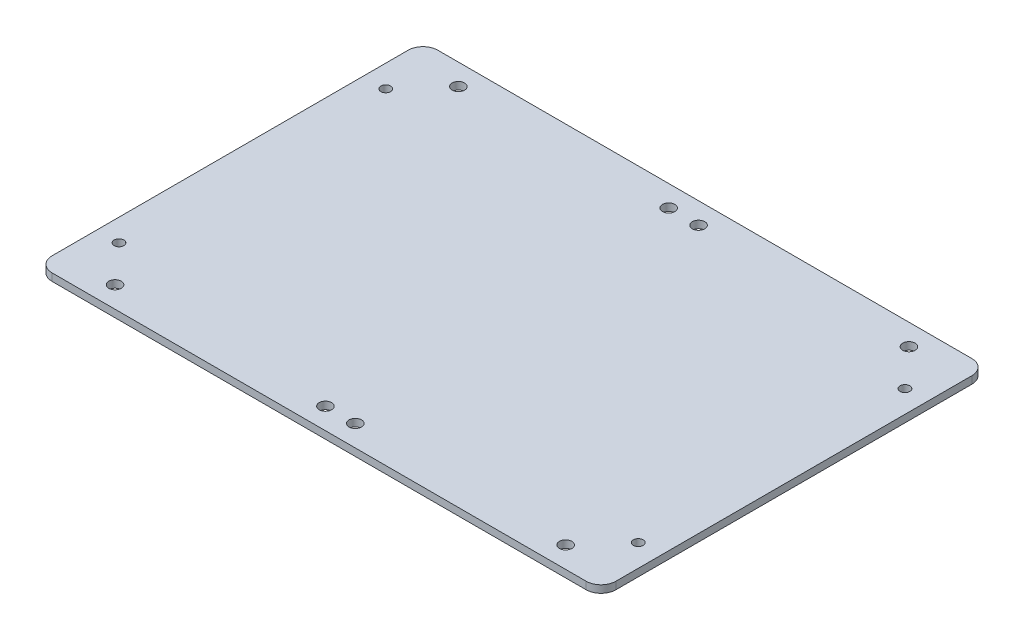
ISO-10303-21;
HEADER;
FILE_DESCRIPTION(('STEP AP214'),'2;1');
FILE_NAME('part.step','',(''),(''),'','','');
FILE_SCHEMA(('AUTOMOTIVE_DESIGN { 1 0 10303 214 1 1 1 1 }'));
ENDSEC;
DATA;
#1=APPLICATION_CONTEXT('core data for automotive mechanical design processes');
#2=APPLICATION_PROTOCOL_DEFINITION('international standard','automotive_design',2000,#1);
#3=PRODUCT_CONTEXT('',#1,'mechanical');
#4=PRODUCT('Part','Part','',(#3));
#5=PRODUCT_RELATED_PRODUCT_CATEGORY('part','',(#4));
#6=PRODUCT_DEFINITION_FORMATION('','',#4);
#7=PRODUCT_DEFINITION_CONTEXT('part definition',#1,'design');
#8=PRODUCT_DEFINITION('design','',#6,#7);
#9=PRODUCT_DEFINITION_SHAPE('','',#8);
#10=(LENGTH_UNIT() NAMED_UNIT(*) SI_UNIT(.MILLI.,.METRE.));
#11=(NAMED_UNIT(*) PLANE_ANGLE_UNIT() SI_UNIT($,.RADIAN.));
#12=(NAMED_UNIT(*) SI_UNIT($,.STERADIAN.) SOLID_ANGLE_UNIT());
#13=UNCERTAINTY_MEASURE_WITH_UNIT(LENGTH_MEASURE(1.E-05),#10,'distance_accuracy_value','');
#14=(GEOMETRIC_REPRESENTATION_CONTEXT(3) GLOBAL_UNCERTAINTY_ASSIGNED_CONTEXT((#13)) GLOBAL_UNIT_ASSIGNED_CONTEXT((#10,
#11,#12)) REPRESENTATION_CONTEXT('',''));
#15=CARTESIAN_POINT('',(0.,0.,0.));
#16=DIRECTION('',(0.,0.,1.));
#17=DIRECTION('',(1.,0.,0.));
#18=AXIS2_PLACEMENT_3D('',#15,#16,#17);
#19=CARTESIAN_POINT('',(0.,6.35,0.));
#20=DIRECTION('',(0.,-1.,0.));
#21=DIRECTION('',(0.,0.,-1.));
#22=AXIS2_PLACEMENT_3D('',#19,#20,#21);
#23=PLANE('',#22);
#24=DIRECTION('',(1.,0.,0.));
#25=VECTOR('',#24,1.);
#26=CARTESIAN_POINT('',(-38.1,6.35,0.));
#27=LINE('',#26,#25);
#28=CARTESIAN_POINT('',(-25.4,6.35,0.));
#29=VERTEX_POINT('',#28);
#30=CARTESIAN_POINT('',(431.8,6.35,0.));
#31=VERTEX_POINT('',#30);
#32=EDGE_CURVE('E150',#29,#31,#27,.T.);
#33=ORIENTED_EDGE('',*,*,#32,.T.);
#34=CARTESIAN_POINT('',(431.8,6.35,-12.7));
#35=DIRECTION('',(0.,-1.,0.));
#36=DIRECTION('',(0.,0.,-1.));
#37=AXIS2_PLACEMENT_3D('',#34,#35,#36);
#38=CIRCLE('',#37,12.7);
#39=CARTESIAN_POINT('',(444.5,6.35,-12.7));
#40=VERTEX_POINT('',#39);
#41=EDGE_CURVE('E174',#31,#40,#38,.F.);
#42=ORIENTED_EDGE('',*,*,#41,.T.);
#43=DIRECTION('',(0.,0.,-1.));
#44=VECTOR('',#43,1.);
#45=CARTESIAN_POINT('',(444.5,6.35,-330.2));
#46=LINE('',#45,#44);
#47=CARTESIAN_POINT('',(444.5,6.35,-317.5));
#48=VERTEX_POINT('',#47);
#49=EDGE_CURVE('E127',#40,#48,#46,.T.);
#50=ORIENTED_EDGE('',*,*,#49,.T.);
#51=CARTESIAN_POINT('',(431.8,6.35,-317.5));
#52=DIRECTION('',(0.,-1.,0.));
#53=DIRECTION('',(0.,0.,-1.));
#54=AXIS2_PLACEMENT_3D('',#51,#52,#53);
#55=CIRCLE('',#54,12.7);
#56=CARTESIAN_POINT('',(431.8,6.35,-330.2));
#57=VERTEX_POINT('',#56);
#58=EDGE_CURVE('E166',#48,#57,#55,.F.);
#59=ORIENTED_EDGE('',*,*,#58,.T.);
#60=DIRECTION('',(-1.,0.,0.));
#61=VECTOR('',#60,1.);
#62=CARTESIAN_POINT('',(406.4,6.35,-330.2));
#63=LINE('',#62,#61);
#64=CARTESIAN_POINT('',(-25.4,6.35,-330.2));
#65=VERTEX_POINT('',#64);
#66=EDGE_CURVE('E189',#57,#65,#63,.T.);
#67=ORIENTED_EDGE('',*,*,#66,.T.);
#68=CARTESIAN_POINT('',(-25.4,6.35,-317.5));
#69=DIRECTION('',(0.,-1.,0.));
#70=DIRECTION('',(0.,0.,-1.));
#71=AXIS2_PLACEMENT_3D('',#68,#69,#70);
#72=CIRCLE('',#71,12.7);
#73=CARTESIAN_POINT('',(-38.1,6.35,-317.5));
#74=VERTEX_POINT('',#73);
#75=EDGE_CURVE('E62',#65,#74,#72,.F.);
#76=ORIENTED_EDGE('',*,*,#75,.T.);
#77=DIRECTION('',(0.,0.,1.));
#78=VECTOR('',#77,1.);
#79=CARTESIAN_POINT('',(-38.1,6.35,-330.2));
#80=LINE('',#79,#78);
#81=CARTESIAN_POINT('',(-38.1,6.35,-12.7));
#82=VERTEX_POINT('',#81);
#83=EDGE_CURVE('E152',#74,#82,#80,.T.);
#84=ORIENTED_EDGE('',*,*,#83,.T.);
#85=CARTESIAN_POINT('',(-25.4,6.35,-12.7));
#86=DIRECTION('',(0.,-1.,0.));
#87=DIRECTION('',(0.,0.,-1.));
#88=AXIS2_PLACEMENT_3D('',#85,#86,#87);
#89=CIRCLE('',#88,12.7);
#90=EDGE_CURVE('E171',#82,#29,#89,.F.);
#91=ORIENTED_EDGE('',*,*,#90,.T.);
#92=EDGE_LOOP('',(#33,#42,#50,#59,#67,#76,#84,#91));
#93=FACE_BOUND('',#92,.T.);
#94=CARTESIAN_POINT('',(10.3248582778819,6.35,-312.039));
#95=DIRECTION('',(0.,1.,0.));
#96=DIRECTION('',(0.,0.,1.));
#97=AXIS2_PLACEMENT_3D('',#94,#95,#96);
#98=CIRCLE('',#97,5.33400000000001);
#99=CARTESIAN_POINT('',(10.3248582778819,6.35,-306.705));
#100=VERTEX_POINT('',#99);
#101=EDGE_CURVE('E144',#100,#100,#98,.T.);
#102=ORIENTED_EDGE('',*,*,#101,.F.);
#103=EDGE_LOOP('',(#102));
#104=FACE_BOUND('',#103,.T.);
#105=CARTESIAN_POINT('',(10.3248582778819,6.35,-18.161));
#106=DIRECTION('',(0.,1.,0.));
#107=DIRECTION('',(0.,0.,1.));
#108=AXIS2_PLACEMENT_3D('',#105,#106,#107);
#109=CIRCLE('',#108,5.334);
#110=CARTESIAN_POINT('',(10.3248582778819,6.35,-12.827));
#111=VERTEX_POINT('',#110);
#112=EDGE_CURVE('E211',#111,#111,#109,.T.);
#113=ORIENTED_EDGE('',*,*,#112,.F.);
#114=EDGE_LOOP('',(#113));
#115=FACE_BOUND('',#114,.T.);
#116=CARTESIAN_POINT('',(190.410858277882,6.35,-312.039));
#117=DIRECTION('',(0.,1.,0.));
#118=DIRECTION('',(0.,0.,1.));
#119=AXIS2_PLACEMENT_3D('',#116,#117,#118);
#120=CIRCLE('',#119,5.334);
#121=CARTESIAN_POINT('',(190.410858277882,6.35,-306.705));
#122=VERTEX_POINT('',#121);
#123=EDGE_CURVE('E219',#122,#122,#120,.T.);
#124=ORIENTED_EDGE('',*,*,#123,.F.);
#125=EDGE_LOOP('',(#124));
#126=FACE_BOUND('',#125,.T.);
#127=CARTESIAN_POINT('',(190.410858277882,6.35,-18.161));
#128=DIRECTION('',(0.,1.,0.));
#129=DIRECTION('',(0.,0.,-1.));
#130=AXIS2_PLACEMENT_3D('',#127,#128,#129);
#131=CIRCLE('',#130,5.334);
#132=CARTESIAN_POINT('',(190.410858277882,6.35,-23.495));
#133=VERTEX_POINT('',#132);
#134=EDGE_CURVE('E227',#133,#133,#131,.T.);
#135=ORIENTED_EDGE('',*,*,#134,.F.);
#136=EDGE_LOOP('',(#135));
#137=FACE_BOUND('',#136,.T.);
#138=CARTESIAN_POINT('',(215.989141722118,6.35,-18.161));
#139=DIRECTION('',(0.,1.,0.));
#140=DIRECTION('',(0.,0.,1.));
#141=AXIS2_PLACEMENT_3D('',#138,#139,#140);
#142=CIRCLE('',#141,5.334);
#143=CARTESIAN_POINT('',(215.989141722118,6.35,-12.827));
#144=VERTEX_POINT('',#143);
#145=EDGE_CURVE('E235',#144,#144,#142,.T.);
#146=ORIENTED_EDGE('',*,*,#145,.F.);
#147=EDGE_LOOP('',(#146));
#148=FACE_BOUND('',#147,.T.);
#149=CARTESIAN_POINT('',(396.075141722118,6.35,-18.161));
#150=DIRECTION('',(0.,1.,0.));
#151=DIRECTION('',(0.,0.,-1.));
#152=AXIS2_PLACEMENT_3D('',#149,#150,#151);
#153=CIRCLE('',#152,5.33399999999999);
#154=CARTESIAN_POINT('',(396.075141722118,6.35,-23.495));
#155=VERTEX_POINT('',#154);
#156=EDGE_CURVE('E243',#155,#155,#153,.T.);
#157=ORIENTED_EDGE('',*,*,#156,.F.);
#158=EDGE_LOOP('',(#157));
#159=FACE_BOUND('',#158,.T.);
#160=CARTESIAN_POINT('',(215.989141722118,6.35,-312.039));
#161=DIRECTION('',(0.,1.,0.));
#162=DIRECTION('',(0.,0.,-1.));
#163=AXIS2_PLACEMENT_3D('',#160,#161,#162);
#164=CIRCLE('',#163,5.334);
#165=CARTESIAN_POINT('',(215.989141722118,6.35,-317.373));
#166=VERTEX_POINT('',#165);
#167=EDGE_CURVE('E251',#166,#166,#164,.T.);
#168=ORIENTED_EDGE('',*,*,#167,.F.);
#169=EDGE_LOOP('',(#168));
#170=FACE_BOUND('',#169,.T.);
#171=CARTESIAN_POINT('',(396.075141722118,6.35,-312.039));
#172=DIRECTION('',(0.,1.,0.));
#173=DIRECTION('',(0.,0.,-1.));
#174=AXIS2_PLACEMENT_3D('',#171,#172,#173);
#175=CIRCLE('',#174,5.334);
#176=CARTESIAN_POINT('',(396.075141722118,6.35,-317.373));
#177=VERTEX_POINT('',#176);
#178=EDGE_CURVE('E259',#177,#177,#175,.T.);
#179=ORIENTED_EDGE('',*,*,#178,.F.);
#180=EDGE_LOOP('',(#179));
#181=FACE_BOUND('',#180,.T.);
#182=CARTESIAN_POINT('',(-19.05,6.35,-279.273));
#183=DIRECTION('',(0.,1.,0.));
#184=DIRECTION('',(0.,0.,1.));
#185=AXIS2_PLACEMENT_3D('',#182,#183,#184);
#186=CIRCLE('',#185,4.191);
#187=CARTESIAN_POINT('',(-19.05,6.35,-275.082));
#188=VERTEX_POINT('',#187);
#189=EDGE_CURVE('E267',#188,#188,#186,.T.);
#190=ORIENTED_EDGE('',*,*,#189,.F.);
#191=EDGE_LOOP('',(#190));
#192=FACE_BOUND('',#191,.T.);
#193=CARTESIAN_POINT('',(-19.05,6.35,-50.927));
#194=DIRECTION('',(0.,1.,0.));
#195=DIRECTION('',(0.,0.,-1.));
#196=AXIS2_PLACEMENT_3D('',#193,#194,#195);
#197=CIRCLE('',#196,4.191);
#198=CARTESIAN_POINT('',(-19.05,6.35,-55.118));
#199=VERTEX_POINT('',#198);
#200=EDGE_CURVE('E275',#199,#199,#197,.T.);
#201=ORIENTED_EDGE('',*,*,#200,.F.);
#202=EDGE_LOOP('',(#201));
#203=FACE_BOUND('',#202,.T.);
#204=CARTESIAN_POINT('',(425.45,6.35,-50.927));
#205=DIRECTION('',(0.,1.,0.));
#206=DIRECTION('',(0.,0.,1.));
#207=AXIS2_PLACEMENT_3D('',#204,#205,#206);
#208=CIRCLE('',#207,4.19100000000002);
#209=CARTESIAN_POINT('',(425.45,6.35,-46.736));
#210=VERTEX_POINT('',#209);
#211=EDGE_CURVE('E283',#210,#210,#208,.T.);
#212=ORIENTED_EDGE('',*,*,#211,.F.);
#213=EDGE_LOOP('',(#212));
#214=FACE_BOUND('',#213,.T.);
#215=CARTESIAN_POINT('',(425.45,6.35,-279.273));
#216=DIRECTION('',(0.,1.,0.));
#217=DIRECTION('',(0.,0.,-1.));
#218=AXIS2_PLACEMENT_3D('',#215,#216,#217);
#219=CIRCLE('',#218,4.19100000000002);
#220=CARTESIAN_POINT('',(425.45,6.35,-283.464));
#221=VERTEX_POINT('',#220);
#222=EDGE_CURVE('E291',#221,#221,#219,.T.);
#223=ORIENTED_EDGE('',*,*,#222,.F.);
#224=EDGE_LOOP('',(#223));
#225=FACE_BOUND('',#224,.T.);
#226=ADVANCED_FACE('F39',(#93,#104,#115,#126,#137,#148,#159,#170,#181,#192,#203,#214,#225),#23,.F.);
#227=CARTESIAN_POINT('',(0.,0.,0.));
#228=DIRECTION('',(0.,-1.,0.));
#229=DIRECTION('',(0.,0.,-1.));
#230=AXIS2_PLACEMENT_3D('',#227,#228,#229);
#231=PLANE('',#230);
#232=CARTESIAN_POINT('',(425.45,0.,-50.927));
#233=DIRECTION('',(0.,1.,0.));
#234=DIRECTION('',(0.,0.,1.));
#235=AXIS2_PLACEMENT_3D('',#232,#233,#234);
#236=CIRCLE('',#235,4.19100000000002);
#237=CARTESIAN_POINT('',(425.45,0.,-46.736));
#238=VERTEX_POINT('',#237);
#239=EDGE_CURVE('E287',#238,#238,#236,.T.);
#240=ORIENTED_EDGE('',*,*,#239,.T.);
#241=EDGE_LOOP('',(#240));
#242=FACE_BOUND('',#241,.T.);
#243=CARTESIAN_POINT('',(-19.05,0.,-279.273));
#244=DIRECTION('',(0.,1.,0.));
#245=DIRECTION('',(0.,0.,1.));
#246=AXIS2_PLACEMENT_3D('',#243,#244,#245);
#247=CIRCLE('',#246,4.191);
#248=CARTESIAN_POINT('',(-19.05,0.,-275.082));
#249=VERTEX_POINT('',#248);
#250=EDGE_CURVE('E271',#249,#249,#247,.T.);
#251=ORIENTED_EDGE('',*,*,#250,.T.);
#252=EDGE_LOOP('',(#251));
#253=FACE_BOUND('',#252,.T.);
#254=CARTESIAN_POINT('',(215.989141722118,0.,-312.039));
#255=DIRECTION('',(0.,1.,0.));
#256=DIRECTION('',(0.,0.,-1.));
#257=AXIS2_PLACEMENT_3D('',#254,#255,#256);
#258=CIRCLE('',#257,5.334);
#259=CARTESIAN_POINT('',(215.989141722118,0.,-317.373));
#260=VERTEX_POINT('',#259);
#261=EDGE_CURVE('E255',#260,#260,#258,.T.);
#262=ORIENTED_EDGE('',*,*,#261,.T.);
#263=EDGE_LOOP('',(#262));
#264=FACE_BOUND('',#263,.T.);
#265=CARTESIAN_POINT('',(215.989141722118,0.,-18.161));
#266=DIRECTION('',(0.,1.,0.));
#267=DIRECTION('',(0.,0.,1.));
#268=AXIS2_PLACEMENT_3D('',#265,#266,#267);
#269=CIRCLE('',#268,5.334);
#270=CARTESIAN_POINT('',(215.989141722118,0.,-12.827));
#271=VERTEX_POINT('',#270);
#272=EDGE_CURVE('E239',#271,#271,#269,.T.);
#273=ORIENTED_EDGE('',*,*,#272,.T.);
#274=EDGE_LOOP('',(#273));
#275=FACE_BOUND('',#274,.T.);
#276=CARTESIAN_POINT('',(190.410858277882,0.,-312.039));
#277=DIRECTION('',(0.,1.,0.));
#278=DIRECTION('',(0.,0.,1.));
#279=AXIS2_PLACEMENT_3D('',#276,#277,#278);
#280=CIRCLE('',#279,5.334);
#281=CARTESIAN_POINT('',(190.410858277882,0.,-306.705));
#282=VERTEX_POINT('',#281);
#283=EDGE_CURVE('E223',#282,#282,#280,.T.);
#284=ORIENTED_EDGE('',*,*,#283,.T.);
#285=EDGE_LOOP('',(#284));
#286=FACE_BOUND('',#285,.T.);
#287=CARTESIAN_POINT('',(10.3248582778819,0.,-312.039));
#288=DIRECTION('',(0.,1.,0.));
#289=DIRECTION('',(0.,0.,1.));
#290=AXIS2_PLACEMENT_3D('',#287,#288,#289);
#291=CIRCLE('',#290,5.33400000000001);
#292=CARTESIAN_POINT('',(10.3248582778819,0.,-306.705));
#293=VERTEX_POINT('',#292);
#294=EDGE_CURVE('E207',#293,#293,#291,.T.);
#295=ORIENTED_EDGE('',*,*,#294,.T.);
#296=EDGE_LOOP('',(#295));
#297=FACE_BOUND('',#296,.T.);
#298=DIRECTION('',(0.,0.,-1.));
#299=VECTOR('',#298,1.);
#300=CARTESIAN_POINT('',(444.5,0.,-330.2));
#301=LINE('',#300,#299);
#302=CARTESIAN_POINT('',(444.5,0.,-12.7));
#303=VERTEX_POINT('',#302);
#304=CARTESIAN_POINT('',(444.5,0.,-317.5));
#305=VERTEX_POINT('',#304);
#306=EDGE_CURVE('E124',#303,#305,#301,.T.);
#307=ORIENTED_EDGE('',*,*,#306,.F.);
#308=CARTESIAN_POINT('',(431.8,0.,-12.7));
#309=DIRECTION('',(0.,-1.,0.));
#310=DIRECTION('',(0.,0.,-1.));
#311=AXIS2_PLACEMENT_3D('',#308,#309,#310);
#312=CIRCLE('',#311,12.7);
#313=CARTESIAN_POINT('',(431.8,0.,0.));
#314=VERTEX_POINT('',#313);
#315=EDGE_CURVE('E106',#303,#314,#312,.T.);
#316=ORIENTED_EDGE('',*,*,#315,.T.);
#317=DIRECTION('',(1.,0.,0.));
#318=VECTOR('',#317,1.);
#319=CARTESIAN_POINT('',(444.5,0.,0.));
#320=LINE('',#319,#318);
#321=CARTESIAN_POINT('',(-25.4,0.,0.));
#322=VERTEX_POINT('',#321);
#323=EDGE_CURVE('E137',#322,#314,#320,.T.);
#324=ORIENTED_EDGE('',*,*,#323,.F.);
#325=CARTESIAN_POINT('',(-25.4,0.,-12.7));
#326=DIRECTION('',(0.,-1.,0.));
#327=DIRECTION('',(0.,0.,-1.));
#328=AXIS2_PLACEMENT_3D('',#325,#326,#327);
#329=CIRCLE('',#328,12.7);
#330=CARTESIAN_POINT('',(-38.1,0.,-12.7));
#331=VERTEX_POINT('',#330);
#332=EDGE_CURVE('E118',#322,#331,#329,.T.);
#333=ORIENTED_EDGE('',*,*,#332,.T.);
#334=DIRECTION('',(0.,0.,1.));
#335=VECTOR('',#334,1.);
#336=CARTESIAN_POINT('',(-38.1,0.,-330.2));
#337=LINE('',#336,#335);
#338=CARTESIAN_POINT('',(-38.1,0.,-317.5));
#339=VERTEX_POINT('',#338);
#340=EDGE_CURVE('E142',#339,#331,#337,.T.);
#341=ORIENTED_EDGE('',*,*,#340,.F.);
#342=CARTESIAN_POINT('',(-25.4,0.,-317.5));
#343=DIRECTION('',(0.,-1.,0.));
#344=DIRECTION('',(0.,0.,-1.));
#345=AXIS2_PLACEMENT_3D('',#342,#343,#344);
#346=CIRCLE('',#345,12.7);
#347=CARTESIAN_POINT('',(-25.4,0.,-330.2));
#348=VERTEX_POINT('',#347);
#349=EDGE_CURVE('E156',#339,#348,#346,.T.);
#350=ORIENTED_EDGE('',*,*,#349,.T.);
#351=DIRECTION('',(-1.,0.,0.));
#352=VECTOR('',#351,1.);
#353=CARTESIAN_POINT('',(0.,0.,-330.2));
#354=LINE('',#353,#352);
#355=CARTESIAN_POINT('',(431.8,0.,-330.2));
#356=VERTEX_POINT('',#355);
#357=EDGE_CURVE('E136',#356,#348,#354,.T.);
#358=ORIENTED_EDGE('',*,*,#357,.F.);
#359=CARTESIAN_POINT('',(431.8,0.,-317.5));
#360=DIRECTION('',(0.,-1.,0.));
#361=DIRECTION('',(0.,0.,-1.));
#362=AXIS2_PLACEMENT_3D('',#359,#360,#361);
#363=CIRCLE('',#362,12.7);
#364=EDGE_CURVE('E129',#356,#305,#363,.T.);
#365=ORIENTED_EDGE('',*,*,#364,.T.);
#366=EDGE_LOOP('',(#307,#316,#324,#333,#341,#350,#358,#365));
#367=FACE_BOUND('',#366,.T.);
#368=CARTESIAN_POINT('',(10.3248582778819,0.,-18.161));
#369=DIRECTION('',(0.,1.,0.));
#370=DIRECTION('',(0.,0.,1.));
#371=AXIS2_PLACEMENT_3D('',#368,#369,#370);
#372=CIRCLE('',#371,5.334);
#373=CARTESIAN_POINT('',(10.3248582778819,0.,-12.827));
#374=VERTEX_POINT('',#373);
#375=EDGE_CURVE('E215',#374,#374,#372,.T.);
#376=ORIENTED_EDGE('',*,*,#375,.T.);
#377=EDGE_LOOP('',(#376));
#378=FACE_BOUND('',#377,.T.);
#379=CARTESIAN_POINT('',(190.410858277882,0.,-18.161));
#380=DIRECTION('',(0.,1.,0.));
#381=DIRECTION('',(0.,0.,-1.));
#382=AXIS2_PLACEMENT_3D('',#379,#380,#381);
#383=CIRCLE('',#382,5.334);
#384=CARTESIAN_POINT('',(190.410858277882,0.,-23.495));
#385=VERTEX_POINT('',#384);
#386=EDGE_CURVE('E231',#385,#385,#383,.T.);
#387=ORIENTED_EDGE('',*,*,#386,.T.);
#388=EDGE_LOOP('',(#387));
#389=FACE_BOUND('',#388,.T.);
#390=CARTESIAN_POINT('',(396.075141722118,0.,-18.161));
#391=DIRECTION('',(0.,1.,0.));
#392=DIRECTION('',(0.,0.,-1.));
#393=AXIS2_PLACEMENT_3D('',#390,#391,#392);
#394=CIRCLE('',#393,5.33399999999999);
#395=CARTESIAN_POINT('',(396.075141722118,0.,-23.495));
#396=VERTEX_POINT('',#395);
#397=EDGE_CURVE('E247',#396,#396,#394,.T.);
#398=ORIENTED_EDGE('',*,*,#397,.T.);
#399=EDGE_LOOP('',(#398));
#400=FACE_BOUND('',#399,.T.);
#401=CARTESIAN_POINT('',(396.075141722118,0.,-312.039));
#402=DIRECTION('',(0.,1.,0.));
#403=DIRECTION('',(0.,0.,-1.));
#404=AXIS2_PLACEMENT_3D('',#401,#402,#403);
#405=CIRCLE('',#404,5.334);
#406=CARTESIAN_POINT('',(396.075141722118,0.,-317.373));
#407=VERTEX_POINT('',#406);
#408=EDGE_CURVE('E263',#407,#407,#405,.T.);
#409=ORIENTED_EDGE('',*,*,#408,.T.);
#410=EDGE_LOOP('',(#409));
#411=FACE_BOUND('',#410,.T.);
#412=CARTESIAN_POINT('',(-19.05,0.,-50.927));
#413=DIRECTION('',(0.,1.,0.));
#414=DIRECTION('',(0.,0.,-1.));
#415=AXIS2_PLACEMENT_3D('',#412,#413,#414);
#416=CIRCLE('',#415,4.191);
#417=CARTESIAN_POINT('',(-19.05,0.,-55.118));
#418=VERTEX_POINT('',#417);
#419=EDGE_CURVE('E279',#418,#418,#416,.T.);
#420=ORIENTED_EDGE('',*,*,#419,.T.);
#421=EDGE_LOOP('',(#420));
#422=FACE_BOUND('',#421,.T.);
#423=CARTESIAN_POINT('',(425.45,0.,-279.273));
#424=DIRECTION('',(0.,1.,0.));
#425=DIRECTION('',(0.,0.,-1.));
#426=AXIS2_PLACEMENT_3D('',#423,#424,#425);
#427=CIRCLE('',#426,4.19100000000002);
#428=CARTESIAN_POINT('',(425.45,0.,-283.464));
#429=VERTEX_POINT('',#428);
#430=EDGE_CURVE('E295',#429,#429,#427,.T.);
#431=ORIENTED_EDGE('',*,*,#430,.T.);
#432=EDGE_LOOP('',(#431));
#433=FACE_BOUND('',#432,.T.);
#434=ADVANCED_FACE('F132',(#242,#253,#264,#275,#286,#297,#367,#378,#389,#400,#411,#422,#433),
#231,.T.);
#435=CARTESIAN_POINT('',(444.5,6.35,0.));
#436=DIRECTION('',(0.,0.,-1.));
#437=DIRECTION('',(-1.,0.,0.));
#438=AXIS2_PLACEMENT_3D('',#435,#436,#437);
#439=PLANE('',#438);
#440=ORIENTED_EDGE('',*,*,#323,.T.);
#441=DIRECTION('',(0.,-1.,0.));
#442=VECTOR('',#441,1.);
#443=CARTESIAN_POINT('',(431.8,6.35,0.));
#444=LINE('',#443,#442);
#445=EDGE_CURVE('E111',#314,#31,#444,.F.);
#446=ORIENTED_EDGE('',*,*,#445,.T.);
#447=ORIENTED_EDGE('',*,*,#32,.F.);
#448=DIRECTION('',(0.,-1.,0.));
#449=VECTOR('',#448,1.);
#450=CARTESIAN_POINT('',(-25.4,6.35,0.));
#451=LINE('',#450,#449);
#452=EDGE_CURVE('E117',#29,#322,#451,.T.);
#453=ORIENTED_EDGE('',*,*,#452,.T.);
#454=EDGE_LOOP('',(#440,#446,#447,#453));
#455=FACE_BOUND('',#454,.T.);
#456=ADVANCED_FACE('F311',(#455),#439,.F.);
#457=CARTESIAN_POINT('',(444.5,6.35,-330.2));
#458=DIRECTION('',(-1.,0.,0.));
#459=DIRECTION('',(0.,0.,1.));
#460=AXIS2_PLACEMENT_3D('',#457,#458,#459);
#461=PLANE('',#460);
#462=ORIENTED_EDGE('',*,*,#49,.F.);
#463=DIRECTION('',(0.,-1.,0.));
#464=VECTOR('',#463,1.);
#465=CARTESIAN_POINT('',(444.5,6.35,-12.7));
#466=LINE('',#465,#464);
#467=EDGE_CURVE('E110',#40,#303,#466,.T.);
#468=ORIENTED_EDGE('',*,*,#467,.T.);
#469=ORIENTED_EDGE('',*,*,#306,.T.);
#470=DIRECTION('',(0.,-1.,0.));
#471=VECTOR('',#470,1.);
#472=CARTESIAN_POINT('',(444.5,6.35,-317.5));
#473=LINE('',#472,#471);
#474=EDGE_CURVE('E130',#305,#48,#473,.F.);
#475=ORIENTED_EDGE('',*,*,#474,.T.);
#476=EDGE_LOOP('',(#462,#468,#469,#475));
#477=FACE_BOUND('',#476,.T.);
#478=ADVANCED_FACE('F123',(#477),#461,.F.);
#479=CARTESIAN_POINT('',(0.,6.35,-330.2));
#480=DIRECTION('',(0.,0.,1.));
#481=DIRECTION('',(1.,0.,0.));
#482=AXIS2_PLACEMENT_3D('',#479,#480,#481);
#483=PLANE('',#482);
#484=ORIENTED_EDGE('',*,*,#357,.T.);
#485=DIRECTION('',(0.,-1.,0.));
#486=VECTOR('',#485,1.);
#487=CARTESIAN_POINT('',(-25.4,6.35,-330.2));
#488=LINE('',#487,#486);
#489=EDGE_CURVE('E11',#348,#65,#488,.F.);
#490=ORIENTED_EDGE('',*,*,#489,.T.);
#491=ORIENTED_EDGE('',*,*,#66,.F.);
#492=DIRECTION('',(0.,-1.,0.));
#493=VECTOR('',#492,1.);
#494=CARTESIAN_POINT('',(431.8,6.35,-330.2));
#495=LINE('',#494,#493);
#496=EDGE_CURVE('E48',#57,#356,#495,.T.);
#497=ORIENTED_EDGE('',*,*,#496,.T.);
#498=EDGE_LOOP('',(#484,#490,#491,#497));
#499=FACE_BOUND('',#498,.T.);
#500=ADVANCED_FACE('F187',(#499),#483,.F.);
#501=CARTESIAN_POINT('',(-38.1,6.35,-330.2));
#502=DIRECTION('',(1.,0.,0.));
#503=DIRECTION('',(0.,0.,-1.));
#504=AXIS2_PLACEMENT_3D('',#501,#502,#503);
#505=PLANE('',#504);
#506=ORIENTED_EDGE('',*,*,#340,.T.);
#507=DIRECTION('',(0.,-1.,0.));
#508=VECTOR('',#507,1.);
#509=CARTESIAN_POINT('',(-38.1,6.35,-12.7));
#510=LINE('',#509,#508);
#511=EDGE_CURVE('E55',#331,#82,#510,.F.);
#512=ORIENTED_EDGE('',*,*,#511,.T.);
#513=ORIENTED_EDGE('',*,*,#83,.F.);
#514=DIRECTION('',(0.,-1.,0.));
#515=VECTOR('',#514,1.);
#516=CARTESIAN_POINT('',(-38.1,6.35,-317.5));
#517=LINE('',#516,#515);
#518=EDGE_CURVE('E177',#74,#339,#517,.T.);
#519=ORIENTED_EDGE('',*,*,#518,.T.);
#520=EDGE_LOOP('',(#506,#512,#513,#519));
#521=FACE_BOUND('',#520,.T.);
#522=ADVANCED_FACE('F196',(#521),#505,.F.);
#523=CARTESIAN_POINT('',(10.3248582778819,6.35,-312.039));
#524=DIRECTION('',(0.,-1.,0.));
#525=DIRECTION('',(0.,0.,-1.));
#526=AXIS2_PLACEMENT_3D('',#523,#524,#525);
#527=CYLINDRICAL_SURFACE('',#526,5.33400000000001);
#528=ORIENTED_EDGE('',*,*,#101,.T.);
#529=EDGE_LOOP('',(#528));
#530=FACE_BOUND('',#529,.T.);
#531=ORIENTED_EDGE('',*,*,#294,.F.);
#532=EDGE_LOOP('',(#531));
#533=FACE_BOUND('',#532,.T.);
#534=ADVANCED_FACE('F316',(#530,#533),#527,.F.);
#535=CARTESIAN_POINT('',(10.3248582778819,6.35,-18.161));
#536=DIRECTION('',(0.,-1.,0.));
#537=DIRECTION('',(0.,0.,-1.));
#538=AXIS2_PLACEMENT_3D('',#535,#536,#537);
#539=CYLINDRICAL_SURFACE('',#538,5.334);
#540=ORIENTED_EDGE('',*,*,#112,.T.);
#541=EDGE_LOOP('',(#540));
#542=FACE_BOUND('',#541,.T.);
#543=ORIENTED_EDGE('',*,*,#375,.F.);
#544=EDGE_LOOP('',(#543));
#545=FACE_BOUND('',#544,.T.);
#546=ADVANCED_FACE('F495',(#542,#545),#539,.F.);
#547=CARTESIAN_POINT('',(190.410858277882,6.35,-312.039));
#548=DIRECTION('',(0.,-1.,0.));
#549=DIRECTION('',(0.,0.,-1.));
#550=AXIS2_PLACEMENT_3D('',#547,#548,#549);
#551=CYLINDRICAL_SURFACE('',#550,5.334);
#552=ORIENTED_EDGE('',*,*,#123,.T.);
#553=EDGE_LOOP('',(#552));
#554=FACE_BOUND('',#553,.T.);
#555=ORIENTED_EDGE('',*,*,#283,.F.);
#556=EDGE_LOOP('',(#555));
#557=FACE_BOUND('',#556,.T.);
#558=ADVANCED_FACE('F485',(#554,#557),#551,.F.);
#559=CARTESIAN_POINT('',(190.410858277882,6.35,-18.161));
#560=DIRECTION('',(0.,-1.,0.));
#561=DIRECTION('',(0.,0.,-1.));
#562=AXIS2_PLACEMENT_3D('',#559,#560,#561);
#563=CYLINDRICAL_SURFACE('',#562,5.334);
#564=ORIENTED_EDGE('',*,*,#134,.T.);
#565=EDGE_LOOP('',(#564));
#566=FACE_BOUND('',#565,.T.);
#567=ORIENTED_EDGE('',*,*,#386,.F.);
#568=EDGE_LOOP('',(#567));
#569=FACE_BOUND('',#568,.T.);
#570=ADVANCED_FACE('F475',(#566,#569),#563,.F.);
#571=CARTESIAN_POINT('',(215.989141722118,6.35,-18.161));
#572=DIRECTION('',(0.,-1.,0.));
#573=DIRECTION('',(0.,0.,-1.));
#574=AXIS2_PLACEMENT_3D('',#571,#572,#573);
#575=CYLINDRICAL_SURFACE('',#574,5.334);
#576=ORIENTED_EDGE('',*,*,#145,.T.);
#577=EDGE_LOOP('',(#576));
#578=FACE_BOUND('',#577,.T.);
#579=ORIENTED_EDGE('',*,*,#272,.F.);
#580=EDGE_LOOP('',(#579));
#581=FACE_BOUND('',#580,.T.);
#582=ADVANCED_FACE('F465',(#578,#581),#575,.F.);
#583=CARTESIAN_POINT('',(396.075141722118,6.35,-18.161));
#584=DIRECTION('',(0.,-1.,0.));
#585=DIRECTION('',(0.,0.,-1.));
#586=AXIS2_PLACEMENT_3D('',#583,#584,#585);
#587=CYLINDRICAL_SURFACE('',#586,5.33399999999999);
#588=ORIENTED_EDGE('',*,*,#156,.T.);
#589=EDGE_LOOP('',(#588));
#590=FACE_BOUND('',#589,.T.);
#591=ORIENTED_EDGE('',*,*,#397,.F.);
#592=EDGE_LOOP('',(#591));
#593=FACE_BOUND('',#592,.T.);
#594=ADVANCED_FACE('F455',(#590,#593),#587,.F.);
#595=CARTESIAN_POINT('',(215.989141722118,6.35,-312.039));
#596=DIRECTION('',(0.,-1.,0.));
#597=DIRECTION('',(0.,0.,-1.));
#598=AXIS2_PLACEMENT_3D('',#595,#596,#597);
#599=CYLINDRICAL_SURFACE('',#598,5.334);
#600=ORIENTED_EDGE('',*,*,#167,.T.);
#601=EDGE_LOOP('',(#600));
#602=FACE_BOUND('',#601,.T.);
#603=ORIENTED_EDGE('',*,*,#261,.F.);
#604=EDGE_LOOP('',(#603));
#605=FACE_BOUND('',#604,.T.);
#606=ADVANCED_FACE('F445',(#602,#605),#599,.F.);
#607=CARTESIAN_POINT('',(396.075141722118,6.35,-312.039));
#608=DIRECTION('',(0.,-1.,0.));
#609=DIRECTION('',(0.,0.,-1.));
#610=AXIS2_PLACEMENT_3D('',#607,#608,#609);
#611=CYLINDRICAL_SURFACE('',#610,5.334);
#612=ORIENTED_EDGE('',*,*,#178,.T.);
#613=EDGE_LOOP('',(#612));
#614=FACE_BOUND('',#613,.T.);
#615=ORIENTED_EDGE('',*,*,#408,.F.);
#616=EDGE_LOOP('',(#615));
#617=FACE_BOUND('',#616,.T.);
#618=ADVANCED_FACE('F435',(#614,#617),#611,.F.);
#619=CARTESIAN_POINT('',(-19.05,6.35,-279.273));
#620=DIRECTION('',(0.,-1.,0.));
#621=DIRECTION('',(0.,0.,-1.));
#622=AXIS2_PLACEMENT_3D('',#619,#620,#621);
#623=CYLINDRICAL_SURFACE('',#622,4.191);
#624=ORIENTED_EDGE('',*,*,#189,.T.);
#625=EDGE_LOOP('',(#624));
#626=FACE_BOUND('',#625,.T.);
#627=ORIENTED_EDGE('',*,*,#250,.F.);
#628=EDGE_LOOP('',(#627));
#629=FACE_BOUND('',#628,.T.);
#630=ADVANCED_FACE('F425',(#626,#629),#623,.F.);
#631=CARTESIAN_POINT('',(-19.05,6.35,-50.927));
#632=DIRECTION('',(0.,-1.,0.));
#633=DIRECTION('',(0.,0.,-1.));
#634=AXIS2_PLACEMENT_3D('',#631,#632,#633);
#635=CYLINDRICAL_SURFACE('',#634,4.191);
#636=ORIENTED_EDGE('',*,*,#200,.T.);
#637=EDGE_LOOP('',(#636));
#638=FACE_BOUND('',#637,.T.);
#639=ORIENTED_EDGE('',*,*,#419,.F.);
#640=EDGE_LOOP('',(#639));
#641=FACE_BOUND('',#640,.T.);
#642=ADVANCED_FACE('F415',(#638,#641),#635,.F.);
#643=CARTESIAN_POINT('',(425.45,6.35,-50.927));
#644=DIRECTION('',(0.,-1.,0.));
#645=DIRECTION('',(0.,0.,-1.));
#646=AXIS2_PLACEMENT_3D('',#643,#644,#645);
#647=CYLINDRICAL_SURFACE('',#646,4.19100000000002);
#648=ORIENTED_EDGE('',*,*,#211,.T.);
#649=EDGE_LOOP('',(#648));
#650=FACE_BOUND('',#649,.T.);
#651=ORIENTED_EDGE('',*,*,#239,.F.);
#652=EDGE_LOOP('',(#651));
#653=FACE_BOUND('',#652,.T.);
#654=ADVANCED_FACE('F406',(#650,#653),#647,.F.);
#655=CARTESIAN_POINT('',(425.45,6.35,-279.273));
#656=DIRECTION('',(0.,-1.,0.));
#657=DIRECTION('',(0.,0.,-1.));
#658=AXIS2_PLACEMENT_3D('',#655,#656,#657);
#659=CYLINDRICAL_SURFACE('',#658,4.19100000000002);
#660=ORIENTED_EDGE('',*,*,#222,.T.);
#661=EDGE_LOOP('',(#660));
#662=FACE_BOUND('',#661,.T.);
#663=ORIENTED_EDGE('',*,*,#430,.F.);
#664=EDGE_LOOP('',(#663));
#665=FACE_BOUND('',#664,.T.);
#666=ADVANCED_FACE('F303',(#662,#665),#659,.F.);
#667=CARTESIAN_POINT('',(431.8,6.35,-12.7));
#668=DIRECTION('',(0.,-1.,0.));
#669=DIRECTION('',(0.,0.,-1.));
#670=AXIS2_PLACEMENT_3D('',#667,#668,#669);
#671=CYLINDRICAL_SURFACE('',#670,12.7);
#672=ORIENTED_EDGE('',*,*,#41,.F.);
#673=ORIENTED_EDGE('',*,*,#445,.F.);
#674=ORIENTED_EDGE('',*,*,#315,.F.);
#675=ORIENTED_EDGE('',*,*,#467,.F.);
#676=EDGE_LOOP('',(#672,#673,#674,#675));
#677=FACE_BOUND('',#676,.T.);
#678=ADVANCED_FACE('F109',(#677),#671,.T.);
#679=CARTESIAN_POINT('',(-25.4,6.35,-12.7));
#680=DIRECTION('',(0.,-1.,0.));
#681=DIRECTION('',(0.,0.,-1.));
#682=AXIS2_PLACEMENT_3D('',#679,#680,#681);
#683=CYLINDRICAL_SURFACE('',#682,12.7);
#684=ORIENTED_EDGE('',*,*,#90,.F.);
#685=ORIENTED_EDGE('',*,*,#511,.F.);
#686=ORIENTED_EDGE('',*,*,#332,.F.);
#687=ORIENTED_EDGE('',*,*,#452,.F.);
#688=EDGE_LOOP('',(#684,#685,#686,#687));
#689=FACE_BOUND('',#688,.T.);
#690=ADVANCED_FACE('F330',(#689),#683,.T.);
#691=CARTESIAN_POINT('',(-25.4,6.35,-317.5));
#692=DIRECTION('',(0.,-1.,0.));
#693=DIRECTION('',(0.,0.,-1.));
#694=AXIS2_PLACEMENT_3D('',#691,#692,#693);
#695=CYLINDRICAL_SURFACE('',#694,12.7);
#696=ORIENTED_EDGE('',*,*,#75,.F.);
#697=ORIENTED_EDGE('',*,*,#489,.F.);
#698=ORIENTED_EDGE('',*,*,#349,.F.);
#699=ORIENTED_EDGE('',*,*,#518,.F.);
#700=EDGE_LOOP('',(#696,#697,#698,#699));
#701=FACE_BOUND('',#700,.T.);
#702=ADVANCED_FACE('F195',(#701),#695,.T.);
#703=CARTESIAN_POINT('',(431.8,6.35,-317.5));
#704=DIRECTION('',(0.,-1.,0.));
#705=DIRECTION('',(0.,0.,-1.));
#706=AXIS2_PLACEMENT_3D('',#703,#704,#705);
#707=CYLINDRICAL_SURFACE('',#706,12.7);
#708=ORIENTED_EDGE('',*,*,#58,.F.);
#709=ORIENTED_EDGE('',*,*,#474,.F.);
#710=ORIENTED_EDGE('',*,*,#364,.F.);
#711=ORIENTED_EDGE('',*,*,#496,.F.);
#712=EDGE_LOOP('',(#708,#709,#710,#711));
#713=FACE_BOUND('',#712,.T.);
#714=ADVANCED_FACE('F41',(#713),#707,.T.);
#715=CLOSED_SHELL('',(#226,#434,#456,#478,#500,#522,#534,#546,#558,#570,#582,#594,#606,#618,
#630,#642,#654,#666,#678,#690,#702,#714));
#716=MANIFOLD_SOLID_BREP('B2',#715);
#717=ADVANCED_BREP_SHAPE_REPRESENTATION('',(#18,#716),#14);
#718=SHAPE_DEFINITION_REPRESENTATION(#9,#717);
ENDSEC;
END-ISO-10303-21;
